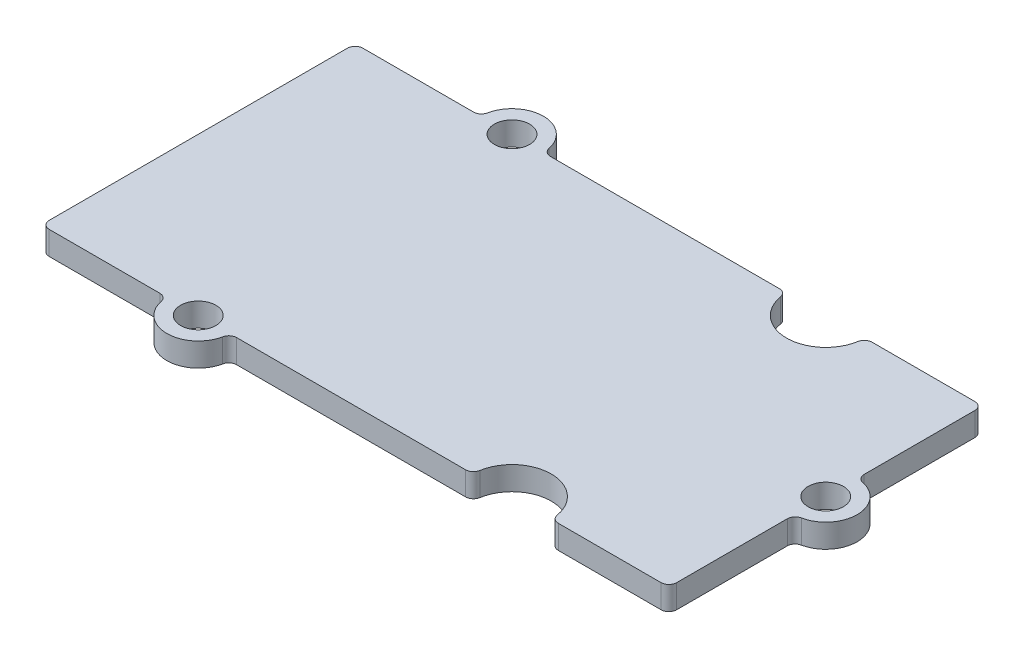
ISO-10303-21;
HEADER;
FILE_DESCRIPTION(('STEP AP214'),'2;1');
FILE_NAME('part.step','',(''),(''),'','','');
FILE_SCHEMA(('AUTOMOTIVE_DESIGN { 1 0 10303 214 1 1 1 1 }'));
ENDSEC;
DATA;
#1=APPLICATION_CONTEXT('core data for automotive mechanical design processes');
#2=APPLICATION_PROTOCOL_DEFINITION('international standard','automotive_design',2000,#1);
#3=PRODUCT_CONTEXT('',#1,'mechanical');
#4=PRODUCT('Part','Part','',(#3));
#5=PRODUCT_RELATED_PRODUCT_CATEGORY('part','',(#4));
#6=PRODUCT_DEFINITION_FORMATION('','',#4);
#7=PRODUCT_DEFINITION_CONTEXT('part definition',#1,'design');
#8=PRODUCT_DEFINITION('design','',#6,#7);
#9=PRODUCT_DEFINITION_SHAPE('','',#8);
#10=(LENGTH_UNIT() NAMED_UNIT(*) SI_UNIT(.MILLI.,.METRE.));
#11=(NAMED_UNIT(*) PLANE_ANGLE_UNIT() SI_UNIT($,.RADIAN.));
#12=(NAMED_UNIT(*) SI_UNIT($,.STERADIAN.) SOLID_ANGLE_UNIT());
#13=UNCERTAINTY_MEASURE_WITH_UNIT(LENGTH_MEASURE(1.E-05),#10,'distance_accuracy_value','');
#14=(GEOMETRIC_REPRESENTATION_CONTEXT(3) GLOBAL_UNCERTAINTY_ASSIGNED_CONTEXT((#13)) GLOBAL_UNIT_ASSIGNED_CONTEXT((#10,
#11,#12)) REPRESENTATION_CONTEXT('',''));
#15=CARTESIAN_POINT('',(0.,0.,0.));
#16=DIRECTION('',(0.,0.,1.));
#17=DIRECTION('',(1.,0.,0.));
#18=AXIS2_PLACEMENT_3D('',#15,#16,#17);
#19=CARTESIAN_POINT('',(10.,1.5,9.99999999999999));
#20=DIRECTION('',(0.,-1.,0.));
#21=DIRECTION('',(0.,0.,-1.));
#22=AXIS2_PLACEMENT_3D('',#19,#20,#21);
#23=CYLINDRICAL_SURFACE('',#22,2.5);
#24=CARTESIAN_POINT('',(10.,0.,9.99999999999999));
#25=DIRECTION('',(0.,1.,0.));
#26=DIRECTION('',(0.,0.,1.));
#27=AXIS2_PLACEMENT_3D('',#24,#25,#26);
#28=CIRCLE('',#27,2.5);
#29=CARTESIAN_POINT('',(7.53496675704184,0.,9.58333333333334));
#30=VERTEX_POINT('',#29);
#31=CARTESIAN_POINT('',(12.4650332429582,0.,9.58333333333334));
#32=VERTEX_POINT('',#31);
#33=EDGE_CURVE('E685',#30,#32,#28,.F.);
#34=ORIENTED_EDGE('',*,*,#33,.T.);
#35=DIRECTION('',(0.,-1.,0.));
#36=VECTOR('',#35,1.);
#37=CARTESIAN_POINT('',(12.4650332429582,1.5,9.58333333333334));
#38=LINE('',#37,#36);
#39=CARTESIAN_POINT('',(12.4650332429582,1.5,9.58333333333334));
#40=VERTEX_POINT('',#39);
#41=EDGE_CURVE('E473',#32,#40,#38,.F.);
#42=ORIENTED_EDGE('',*,*,#41,.T.);
#43=CARTESIAN_POINT('',(10.,1.5,9.99999999999999));
#44=DIRECTION('',(0.,1.,0.));
#45=DIRECTION('',(0.,0.,1.));
#46=AXIS2_PLACEMENT_3D('',#43,#44,#45);
#47=CIRCLE('',#46,2.5);
#48=CARTESIAN_POINT('',(7.53496675704184,1.5,9.58333333333334));
#49=VERTEX_POINT('',#48);
#50=EDGE_CURVE('E622',#49,#40,#47,.F.);
#51=ORIENTED_EDGE('',*,*,#50,.F.);
#52=DIRECTION('',(0.,-1.,0.));
#53=VECTOR('',#52,1.);
#54=CARTESIAN_POINT('',(7.53496675704184,1.5,9.58333333333334));
#55=LINE('',#54,#53);
#56=EDGE_CURVE('E469',#49,#30,#55,.T.);
#57=ORIENTED_EDGE('',*,*,#56,.T.);
#58=EDGE_LOOP('',(#34,#42,#51,#57));
#59=FACE_BOUND('',#58,.T.);
#60=ADVANCED_FACE('F178',(#59),#23,.F.);
#61=CARTESIAN_POINT('',(0.,1.5,10.));
#62=DIRECTION('',(0.,0.,-1.));
#63=DIRECTION('',(-1.,0.,0.));
#64=AXIS2_PLACEMENT_3D('',#61,#62,#63);
#65=PLANE('',#64);
#66=DIRECTION('',(1.,0.,0.));
#67=VECTOR('',#66,1.);
#68=CARTESIAN_POINT('',(0.,1.5,10.));
#69=LINE('',#68,#67);
#70=CARTESIAN_POINT('',(12.9580398915498,1.5,10.));
#71=VERTEX_POINT('',#70);
#72=CARTESIAN_POINT('',(19.5,1.5,10.));
#73=VERTEX_POINT('',#72);
#74=EDGE_CURVE('E402',#71,#73,#69,.T.);
#75=ORIENTED_EDGE('',*,*,#74,.F.);
#76=DIRECTION('',(0.,-1.,0.));
#77=VECTOR('',#76,1.);
#78=CARTESIAN_POINT('',(12.9580398915498,1.5,10.));
#79=LINE('',#78,#77);
#80=CARTESIAN_POINT('',(12.9580398915498,0.,10.));
#81=VERTEX_POINT('',#80);
#82=EDGE_CURVE('E465',#71,#81,#79,.T.);
#83=ORIENTED_EDGE('',*,*,#82,.T.);
#84=DIRECTION('',(1.,0.,0.));
#85=VECTOR('',#84,1.);
#86=CARTESIAN_POINT('',(0.,0.,10.));
#87=LINE('',#86,#85);
#88=CARTESIAN_POINT('',(19.5,0.,10.));
#89=VERTEX_POINT('',#88);
#90=EDGE_CURVE('E684',#81,#89,#87,.T.);
#91=ORIENTED_EDGE('',*,*,#90,.T.);
#92=DIRECTION('',(0.,-1.,0.));
#93=VECTOR('',#92,1.);
#94=CARTESIAN_POINT('',(19.5,1.5,10.));
#95=LINE('',#94,#93);
#96=EDGE_CURVE('E462',#89,#73,#95,.F.);
#97=ORIENTED_EDGE('',*,*,#96,.T.);
#98=EDGE_LOOP('',(#75,#83,#91,#97));
#99=FACE_BOUND('',#98,.T.);
#100=ADVANCED_FACE('F720',(#99),#65,.F.);
#101=CARTESIAN_POINT('',(20.,1.5,0.));
#102=DIRECTION('',(-1.,0.,0.));
#103=DIRECTION('',(0.,0.,1.));
#104=AXIS2_PLACEMENT_3D('',#101,#102,#103);
#105=PLANE('',#104);
#106=DIRECTION('',(0.,0.,-1.));
#107=VECTOR('',#106,1.);
#108=CARTESIAN_POINT('',(20.,0.,0.));
#109=LINE('',#108,#107);
#110=CARTESIAN_POINT('',(20.,0.,9.50000000000001));
#111=VERTEX_POINT('',#110);
#112=CARTESIAN_POINT('',(20.,0.,2.44948974278318));
#113=VERTEX_POINT('',#112);
#114=EDGE_CURVE('E680',#111,#113,#109,.T.);
#115=ORIENTED_EDGE('',*,*,#114,.T.);
#116=DIRECTION('',(0.,1.,0.));
#117=VECTOR('',#116,1.);
#118=CARTESIAN_POINT('',(20.,1.5,2.44948974278318));
#119=LINE('',#118,#117);
#120=CARTESIAN_POINT('',(20.,1.5,2.44948974278318));
#121=VERTEX_POINT('',#120);
#122=EDGE_CURVE('E494',#113,#121,#119,.T.);
#123=ORIENTED_EDGE('',*,*,#122,.T.);
#124=DIRECTION('',(0.,0.,-1.));
#125=VECTOR('',#124,1.);
#126=CARTESIAN_POINT('',(20.,1.5,0.));
#127=LINE('',#126,#125);
#128=CARTESIAN_POINT('',(20.,1.5,9.50000000000001));
#129=VERTEX_POINT('',#128);
#130=EDGE_CURVE('E616',#129,#121,#127,.T.);
#131=ORIENTED_EDGE('',*,*,#130,.F.);
#132=DIRECTION('',(0.,-1.,0.));
#133=VECTOR('',#132,1.);
#134=CARTESIAN_POINT('',(20.,1.5,9.50000000000001));
#135=LINE('',#134,#133);
#136=EDGE_CURVE('E490',#129,#111,#135,.T.);
#137=ORIENTED_EDGE('',*,*,#136,.T.);
#138=EDGE_LOOP('',(#115,#123,#131,#137));
#139=FACE_BOUND('',#138,.T.);
#140=ADVANCED_FACE('F748',(#139),#105,.F.);
#141=CARTESIAN_POINT('',(20.,1.5,-2.44948974278318));
#142=VERTEX_POINT('',#141);
#143=CARTESIAN_POINT('',(20.,1.5,-9.49999999999999));
#144=VERTEX_POINT('',#143);
#145=EDGE_CURVE('E610',#142,#144,#127,.T.);
#146=ORIENTED_EDGE('',*,*,#145,.F.);
#147=DIRECTION('',(0.,1.,0.));
#148=VECTOR('',#147,1.);
#149=CARTESIAN_POINT('',(20.,0.,-2.44948974278318));
#150=LINE('',#149,#148);
#151=CARTESIAN_POINT('',(20.,0.,-2.44948974278318));
#152=VERTEX_POINT('',#151);
#153=EDGE_CURVE('E500',#142,#152,#150,.F.);
#154=ORIENTED_EDGE('',*,*,#153,.T.);
#155=CARTESIAN_POINT('',(20.,0.,-9.49999999999999));
#156=VERTEX_POINT('',#155);
#157=EDGE_CURVE('E679',#152,#156,#109,.T.);
#158=ORIENTED_EDGE('',*,*,#157,.T.);
#159=DIRECTION('',(0.,-1.,0.));
#160=VECTOR('',#159,1.);
#161=CARTESIAN_POINT('',(20.,1.5,-9.49999999999999));
#162=LINE('',#161,#160);
#163=EDGE_CURVE('E497',#156,#144,#162,.F.);
#164=ORIENTED_EDGE('',*,*,#163,.T.);
#165=EDGE_LOOP('',(#146,#154,#158,#164));
#166=FACE_BOUND('',#165,.T.);
#167=ADVANCED_FACE('F730',(#166),#105,.F.);
#168=CARTESIAN_POINT('',(0.,1.5,-9.99999999999999));
#169=DIRECTION('',(0.,0.,-1.));
#170=DIRECTION('',(-1.,0.,0.));
#171=AXIS2_PLACEMENT_3D('',#168,#169,#170);
#172=PLANE('',#171);
#173=DIRECTION('',(1.,0.,0.));
#174=VECTOR('',#173,1.);
#175=CARTESIAN_POINT('',(0.,0.,-9.99999999999999));
#176=LINE('',#175,#174);
#177=CARTESIAN_POINT('',(12.9580398915498,0.,-9.99999999999999));
#178=VERTEX_POINT('',#177);
#179=CARTESIAN_POINT('',(19.5,0.,-9.99999999999999));
#180=VERTEX_POINT('',#179);
#181=EDGE_CURVE('E388',#178,#180,#176,.T.);
#182=ORIENTED_EDGE('',*,*,#181,.F.);
#183=DIRECTION('',(0.,-1.,0.));
#184=VECTOR('',#183,1.);
#185=CARTESIAN_POINT('',(12.9580398915498,1.5,-9.99999999999999));
#186=LINE('',#185,#184);
#187=CARTESIAN_POINT('',(12.9580398915498,1.5,-9.99999999999999));
#188=VERTEX_POINT('',#187);
#189=EDGE_CURVE('E430',#178,#188,#186,.F.);
#190=ORIENTED_EDGE('',*,*,#189,.T.);
#191=DIRECTION('',(1.,0.,0.));
#192=VECTOR('',#191,1.);
#193=CARTESIAN_POINT('',(0.,1.5,-9.99999999999999));
#194=LINE('',#193,#192);
#195=CARTESIAN_POINT('',(19.5,1.5,-9.99999999999999));
#196=VERTEX_POINT('',#195);
#197=EDGE_CURVE('E599',#188,#196,#194,.T.);
#198=ORIENTED_EDGE('',*,*,#197,.T.);
#199=DIRECTION('',(0.,-1.,0.));
#200=VECTOR('',#199,1.);
#201=CARTESIAN_POINT('',(19.5,0.,-9.99999999999999));
#202=LINE('',#201,#200);
#203=EDGE_CURVE('E426',#196,#180,#202,.T.);
#204=ORIENTED_EDGE('',*,*,#203,.T.);
#205=EDGE_LOOP('',(#182,#190,#198,#204));
#206=FACE_BOUND('',#205,.T.);
#207=ADVANCED_FACE('F739',(#206),#172,.T.);
#208=CARTESIAN_POINT('',(10.,1.5,-9.99999999999999));
#209=DIRECTION('',(0.,-1.,0.));
#210=DIRECTION('',(0.,0.,-1.));
#211=AXIS2_PLACEMENT_3D('',#208,#209,#210);
#212=CYLINDRICAL_SURFACE('',#211,2.5);
#213=CARTESIAN_POINT('',(10.,1.5,-9.99999999999999));
#214=DIRECTION('',(0.,1.,0.));
#215=DIRECTION('',(0.,0.,1.));
#216=AXIS2_PLACEMENT_3D('',#213,#214,#215);
#217=CIRCLE('',#216,2.5);
#218=CARTESIAN_POINT('',(7.53496675704184,1.5,-9.58333333333333));
#219=VERTEX_POINT('',#218);
#220=CARTESIAN_POINT('',(12.4650332429582,1.5,-9.58333333333333));
#221=VERTEX_POINT('',#220);
#222=EDGE_CURVE('E605',#219,#221,#217,.T.);
#223=ORIENTED_EDGE('',*,*,#222,.T.);
#224=DIRECTION('',(0.,-1.,0.));
#225=VECTOR('',#224,1.);
#226=CARTESIAN_POINT('',(12.4650332429582,1.5,-9.58333333333333));
#227=LINE('',#226,#225);
#228=CARTESIAN_POINT('',(12.4650332429582,0.,-9.58333333333333));
#229=VERTEX_POINT('',#228);
#230=EDGE_CURVE('E386',#221,#229,#227,.T.);
#231=ORIENTED_EDGE('',*,*,#230,.T.);
#232=CARTESIAN_POINT('',(10.,0.,-9.99999999999999));
#233=DIRECTION('',(0.,1.,0.));
#234=DIRECTION('',(0.,0.,1.));
#235=AXIS2_PLACEMENT_3D('',#232,#233,#234);
#236=CIRCLE('',#235,2.5);
#237=CARTESIAN_POINT('',(7.53496675704184,0.,-9.58333333333333));
#238=VERTEX_POINT('',#237);
#239=EDGE_CURVE('E368',#238,#229,#236,.T.);
#240=ORIENTED_EDGE('',*,*,#239,.F.);
#241=DIRECTION('',(0.,-1.,0.));
#242=VECTOR('',#241,1.);
#243=CARTESIAN_POINT('',(7.53496675704184,1.5,-9.58333333333333));
#244=LINE('',#243,#242);
#245=EDGE_CURVE('E383',#238,#219,#244,.F.);
#246=ORIENTED_EDGE('',*,*,#245,.T.);
#247=EDGE_LOOP('',(#223,#231,#240,#246));
#248=FACE_BOUND('',#247,.T.);
#249=ADVANCED_FACE('F382',(#248),#212,.F.);
#250=CARTESIAN_POINT('',(-7.55051025721681,1.5,-9.99999999999999));
#251=VERTEX_POINT('',#250);
#252=CARTESIAN_POINT('',(7.0419601084502,1.5,-9.99999999999999));
#253=VERTEX_POINT('',#252);
#254=EDGE_CURVE('E597',#251,#253,#194,.T.);
#255=ORIENTED_EDGE('',*,*,#254,.T.);
#256=DIRECTION('',(0.,-1.,0.));
#257=VECTOR('',#256,1.);
#258=CARTESIAN_POINT('',(7.0419601084502,1.5,-9.99999999999999));
#259=LINE('',#258,#257);
#260=CARTESIAN_POINT('',(7.0419601084502,0.,-9.99999999999999));
#261=VERTEX_POINT('',#260);
#262=EDGE_CURVE('E459',#253,#261,#259,.T.);
#263=ORIENTED_EDGE('',*,*,#262,.T.);
#264=CARTESIAN_POINT('',(-7.55051025721681,0.,-9.99999999999999));
#265=VERTEX_POINT('',#264);
#266=EDGE_CURVE('E370',#265,#261,#176,.T.);
#267=ORIENTED_EDGE('',*,*,#266,.F.);
#268=DIRECTION('',(0.,-1.,0.));
#269=VECTOR('',#268,1.);
#270=CARTESIAN_POINT('',(-7.55051025721681,1.5,-9.99999999999999));
#271=LINE('',#270,#269);
#272=EDGE_CURVE('E456',#265,#251,#271,.F.);
#273=ORIENTED_EDGE('',*,*,#272,.T.);
#274=EDGE_LOOP('',(#255,#263,#267,#273));
#275=FACE_BOUND('',#274,.T.);
#276=ADVANCED_FACE('F742',(#275),#172,.T.);
#277=CARTESIAN_POINT('',(-19.5,1.5,-9.99999999999999));
#278=VERTEX_POINT('',#277);
#279=CARTESIAN_POINT('',(-12.4494897427832,1.5,-9.99999999999999));
#280=VERTEX_POINT('',#279);
#281=EDGE_CURVE('E591',#278,#280,#194,.T.);
#282=ORIENTED_EDGE('',*,*,#281,.T.);
#283=DIRECTION('',(0.,-1.,0.));
#284=VECTOR('',#283,1.);
#285=CARTESIAN_POINT('',(-12.4494897427832,1.5,-9.99999999999999));
#286=LINE('',#285,#284);
#287=CARTESIAN_POINT('',(-12.4494897427832,0.,-9.99999999999999));
#288=VERTEX_POINT('',#287);
#289=EDGE_CURVE('E527',#280,#288,#286,.T.);
#290=ORIENTED_EDGE('',*,*,#289,.T.);
#291=CARTESIAN_POINT('',(-19.5,0.,-9.99999999999999));
#292=VERTEX_POINT('',#291);
#293=EDGE_CURVE('E572',#292,#288,#176,.T.);
#294=ORIENTED_EDGE('',*,*,#293,.F.);
#295=DIRECTION('',(0.,-1.,0.));
#296=VECTOR('',#295,1.);
#297=CARTESIAN_POINT('',(-19.5,1.5,-9.99999999999999));
#298=LINE('',#297,#296);
#299=EDGE_CURVE('E524',#292,#278,#298,.F.);
#300=ORIENTED_EDGE('',*,*,#299,.T.);
#301=EDGE_LOOP('',(#282,#290,#294,#300));
#302=FACE_BOUND('',#301,.T.);
#303=ADVANCED_FACE('F594',(#302),#172,.T.);
#304=CARTESIAN_POINT('',(-20.,1.5,0.));
#305=DIRECTION('',(-1.,0.,0.));
#306=DIRECTION('',(0.,0.,1.));
#307=AXIS2_PLACEMENT_3D('',#304,#305,#306);
#308=PLANE('',#307);
#309=DIRECTION('',(0.,0.,-1.));
#310=VECTOR('',#309,1.);
#311=CARTESIAN_POINT('',(-20.,1.5,0.));
#312=LINE('',#311,#310);
#313=CARTESIAN_POINT('',(-20.,1.5,9.50000000000001));
#314=VERTEX_POINT('',#313);
#315=CARTESIAN_POINT('',(-20.,1.5,-9.49999999999999));
#316=VERTEX_POINT('',#315);
#317=EDGE_CURVE('E400',#314,#316,#312,.T.);
#318=ORIENTED_EDGE('',*,*,#317,.T.);
#319=DIRECTION('',(0.,-1.,0.));
#320=VECTOR('',#319,1.);
#321=CARTESIAN_POINT('',(-20.,1.5,-9.49999999999999));
#322=LINE('',#321,#320);
#323=CARTESIAN_POINT('',(-20.,0.,-9.49999999999999));
#324=VERTEX_POINT('',#323);
#325=EDGE_CURVE('E534',#316,#324,#322,.T.);
#326=ORIENTED_EDGE('',*,*,#325,.T.);
#327=DIRECTION('',(0.,0.,-1.));
#328=VECTOR('',#327,1.);
#329=CARTESIAN_POINT('',(-20.,0.,0.));
#330=LINE('',#329,#328);
#331=CARTESIAN_POINT('',(-20.,0.,9.50000000000001));
#332=VERTEX_POINT('',#331);
#333=EDGE_CURVE('E671',#332,#324,#330,.T.);
#334=ORIENTED_EDGE('',*,*,#333,.F.);
#335=DIRECTION('',(0.,-1.,0.));
#336=VECTOR('',#335,1.);
#337=CARTESIAN_POINT('',(-20.,1.5,9.50000000000001));
#338=LINE('',#337,#336);
#339=EDGE_CURVE('E531',#332,#314,#338,.F.);
#340=ORIENTED_EDGE('',*,*,#339,.T.);
#341=EDGE_LOOP('',(#318,#326,#334,#340));
#342=FACE_BOUND('',#341,.T.);
#343=ADVANCED_FACE('F754',(#342),#308,.T.);
#344=CARTESIAN_POINT('',(-19.5,0.,10.));
#345=VERTEX_POINT('',#344);
#346=CARTESIAN_POINT('',(-12.4494897427832,0.,10.));
#347=VERTEX_POINT('',#346);
#348=EDGE_CURVE('E674',#345,#347,#87,.T.);
#349=ORIENTED_EDGE('',*,*,#348,.T.);
#350=DIRECTION('',(0.,-1.,0.));
#351=VECTOR('',#350,1.);
#352=CARTESIAN_POINT('',(-12.4494897427832,1.5,10.));
#353=LINE('',#352,#351);
#354=CARTESIAN_POINT('',(-12.4494897427832,1.5,10.));
#355=VERTEX_POINT('',#354);
#356=EDGE_CURVE('E514',#347,#355,#353,.F.);
#357=ORIENTED_EDGE('',*,*,#356,.T.);
#358=CARTESIAN_POINT('',(-19.5,1.5,10.));
#359=VERTEX_POINT('',#358);
#360=EDGE_CURVE('E394',#359,#355,#69,.T.);
#361=ORIENTED_EDGE('',*,*,#360,.F.);
#362=DIRECTION('',(0.,-1.,0.));
#363=VECTOR('',#362,1.);
#364=CARTESIAN_POINT('',(-19.5,0.,10.));
#365=LINE('',#364,#363);
#366=EDGE_CURVE('E510',#359,#345,#365,.T.);
#367=ORIENTED_EDGE('',*,*,#366,.T.);
#368=EDGE_LOOP('',(#349,#357,#361,#367));
#369=FACE_BOUND('',#368,.T.);
#370=ADVANCED_FACE('F761',(#369),#65,.F.);
#371=CARTESIAN_POINT('',(-7.55051025721681,0.,10.));
#372=VERTEX_POINT('',#371);
#373=CARTESIAN_POINT('',(7.0419601084502,0.,10.));
#374=VERTEX_POINT('',#373);
#375=EDGE_CURVE('E670',#372,#374,#87,.T.);
#376=ORIENTED_EDGE('',*,*,#375,.T.);
#377=DIRECTION('',(0.,-1.,0.));
#378=VECTOR('',#377,1.);
#379=CARTESIAN_POINT('',(7.0419601084502,1.5,10.));
#380=LINE('',#379,#378);
#381=CARTESIAN_POINT('',(7.0419601084502,1.5,10.));
#382=VERTEX_POINT('',#381);
#383=EDGE_CURVE('E480',#374,#382,#380,.F.);
#384=ORIENTED_EDGE('',*,*,#383,.T.);
#385=CARTESIAN_POINT('',(-7.55051025721681,1.5,10.));
#386=VERTEX_POINT('',#385);
#387=EDGE_CURVE('E403',#386,#382,#69,.T.);
#388=ORIENTED_EDGE('',*,*,#387,.F.);
#389=DIRECTION('',(0.,-1.,0.));
#390=VECTOR('',#389,1.);
#391=CARTESIAN_POINT('',(-7.55051025721681,1.5,10.));
#392=LINE('',#391,#390);
#393=EDGE_CURVE('E476',#386,#372,#392,.T.);
#394=ORIENTED_EDGE('',*,*,#393,.T.);
#395=EDGE_LOOP('',(#376,#384,#388,#394));
#396=FACE_BOUND('',#395,.T.);
#397=ADVANCED_FACE('F701',(#396),#65,.F.);
#398=CARTESIAN_POINT('',(0.,0.,0.));
#399=DIRECTION('',(0.,1.,0.));
#400=DIRECTION('',(0.,0.,1.));
#401=AXIS2_PLACEMENT_3D('',#398,#399,#400);
#402=PLANE('',#401);
#403=CARTESIAN_POINT('',(20.,0.,0.));
#404=DIRECTION('',(0.,1.,0.));
#405=DIRECTION('',(0.,0.,1.));
#406=AXIS2_PLACEMENT_3D('',#403,#404,#405);
#407=CIRCLE('',#406,1.125);
#408=CARTESIAN_POINT('',(20.,0.,1.125));
#409=VERTEX_POINT('',#408);
#410=EDGE_CURVE('E646',#409,#409,#407,.T.);
#411=ORIENTED_EDGE('',*,*,#410,.T.);
#412=EDGE_LOOP('',(#411));
#413=FACE_BOUND('',#412,.T.);
#414=CARTESIAN_POINT('',(-9.99999999999999,0.,9.99999999999999));
#415=DIRECTION('',(0.,1.,0.));
#416=DIRECTION('',(0.,0.,1.));
#417=AXIS2_PLACEMENT_3D('',#414,#415,#416);
#418=CIRCLE('',#417,1.125);
#419=CARTESIAN_POINT('',(-9.99999999999999,0.,11.125));
#420=VERTEX_POINT('',#419);
#421=EDGE_CURVE('E638',#420,#420,#418,.T.);
#422=ORIENTED_EDGE('',*,*,#421,.T.);
#423=EDGE_LOOP('',(#422));
#424=FACE_BOUND('',#423,.T.);
#425=CARTESIAN_POINT('',(-9.99999999999999,0.,-9.99999999999999));
#426=DIRECTION('',(0.,1.,0.));
#427=DIRECTION('',(0.,0.,1.));
#428=AXIS2_PLACEMENT_3D('',#425,#426,#427);
#429=CIRCLE('',#428,1.125);
#430=CARTESIAN_POINT('',(-9.99999999999999,0.,-8.875));
#431=VERTEX_POINT('',#430);
#432=EDGE_CURVE('E630',#431,#431,#429,.T.);
#433=ORIENTED_EDGE('',*,*,#432,.T.);
#434=EDGE_LOOP('',(#433));
#435=FACE_BOUND('',#434,.T.);
#436=ORIENTED_EDGE('',*,*,#239,.T.);
#437=CARTESIAN_POINT('',(12.9580398915498,0.,-9.49999999999999));
#438=DIRECTION('',(0.,1.,0.));
#439=DIRECTION('',(0.,0.,1.));
#440=AXIS2_PLACEMENT_3D('',#437,#438,#439);
#441=CIRCLE('',#440,0.5);
#442=EDGE_CURVE('E376',#229,#178,#441,.F.);
#443=ORIENTED_EDGE('',*,*,#442,.T.);
#444=ORIENTED_EDGE('',*,*,#181,.T.);
#445=CARTESIAN_POINT('',(19.5,0.,-9.49999999999999));
#446=DIRECTION('',(0.,1.,0.));
#447=DIRECTION('',(0.,0.,1.));
#448=AXIS2_PLACEMENT_3D('',#445,#446,#447);
#449=CIRCLE('',#448,0.5);
#450=EDGE_CURVE('E416',#180,#156,#449,.F.);
#451=ORIENTED_EDGE('',*,*,#450,.T.);
#452=ORIENTED_EDGE('',*,*,#157,.F.);
#453=CARTESIAN_POINT('',(20.5,0.,-2.44948974278318));
#454=DIRECTION('',(0.,1.,0.));
#455=DIRECTION('',(0.,0.,1.));
#456=AXIS2_PLACEMENT_3D('',#453,#454,#455);
#457=CIRCLE('',#456,0.5);
#458=CARTESIAN_POINT('',(20.4,0.,-1.95959179422654));
#459=VERTEX_POINT('',#458);
#460=EDGE_CURVE('E544',#152,#459,#457,.T.);
#461=ORIENTED_EDGE('',*,*,#460,.T.);
#462=CARTESIAN_POINT('',(20.,0.,0.));
#463=DIRECTION('',(0.,1.,0.));
#464=DIRECTION('',(0.,0.,1.));
#465=AXIS2_PLACEMENT_3D('',#462,#463,#464);
#466=CIRCLE('',#465,2.);
#467=CARTESIAN_POINT('',(20.4,0.,1.95959179422654));
#468=VERTEX_POINT('',#467);
#469=EDGE_CURVE('E405',#468,#459,#466,.T.);
#470=ORIENTED_EDGE('',*,*,#469,.F.);
#471=CARTESIAN_POINT('',(20.5,0.,2.44948974278318));
#472=DIRECTION('',(0.,1.,0.));
#473=DIRECTION('',(0.,0.,1.));
#474=AXIS2_PLACEMENT_3D('',#471,#472,#473);
#475=CIRCLE('',#474,0.5);
#476=EDGE_CURVE('E538',#468,#113,#475,.T.);
#477=ORIENTED_EDGE('',*,*,#476,.T.);
#478=ORIENTED_EDGE('',*,*,#114,.F.);
#479=CARTESIAN_POINT('',(19.5,0.,9.50000000000001));
#480=DIRECTION('',(0.,1.,0.));
#481=DIRECTION('',(0.,0.,1.));
#482=AXIS2_PLACEMENT_3D('',#479,#480,#481);
#483=CIRCLE('',#482,0.5);
#484=EDGE_CURVE('E413',#111,#89,#483,.F.);
#485=ORIENTED_EDGE('',*,*,#484,.T.);
#486=ORIENTED_EDGE('',*,*,#90,.F.);
#487=CARTESIAN_POINT('',(12.9580398915498,0.,9.50000000000001));
#488=DIRECTION('',(0.,1.,0.));
#489=DIRECTION('',(0.,0.,1.));
#490=AXIS2_PLACEMENT_3D('',#487,#488,#489);
#491=CIRCLE('',#490,0.5);
#492=EDGE_CURVE('E377',#81,#32,#491,.F.);
#493=ORIENTED_EDGE('',*,*,#492,.T.);
#494=ORIENTED_EDGE('',*,*,#33,.F.);
#495=CARTESIAN_POINT('',(7.0419601084502,0.,9.50000000000001));
#496=DIRECTION('',(0.,1.,0.));
#497=DIRECTION('',(0.,0.,1.));
#498=AXIS2_PLACEMENT_3D('',#495,#496,#497);
#499=CIRCLE('',#498,0.5);
#500=EDGE_CURVE('E419',#30,#374,#499,.F.);
#501=ORIENTED_EDGE('',*,*,#500,.T.);
#502=ORIENTED_EDGE('',*,*,#375,.F.);
#503=CARTESIAN_POINT('',(-7.55051025721681,0.,10.5));
#504=DIRECTION('',(0.,1.,0.));
#505=DIRECTION('',(0.,0.,1.));
#506=AXIS2_PLACEMENT_3D('',#503,#504,#505);
#507=CIRCLE('',#506,0.5);
#508=CARTESIAN_POINT('',(-8.04040820577345,0.,10.4));
#509=VERTEX_POINT('',#508);
#510=EDGE_CURVE('E550',#372,#509,#507,.T.);
#511=ORIENTED_EDGE('',*,*,#510,.T.);
#512=CARTESIAN_POINT('',(-9.99999999999999,0.,9.99999999999999));
#513=DIRECTION('',(0.,-1.,0.));
#514=DIRECTION('',(0.,0.,-1.));
#515=AXIS2_PLACEMENT_3D('',#512,#513,#514);
#516=CIRCLE('',#515,2.);
#517=CARTESIAN_POINT('',(-11.9595917942265,0.,10.4));
#518=VERTEX_POINT('',#517);
#519=EDGE_CURVE('E663',#509,#518,#516,.T.);
#520=ORIENTED_EDGE('',*,*,#519,.T.);
#521=CARTESIAN_POINT('',(-12.4494897427832,0.,10.5));
#522=DIRECTION('',(0.,1.,0.));
#523=DIRECTION('',(0.,0.,1.));
#524=AXIS2_PLACEMENT_3D('',#521,#522,#523);
#525=CIRCLE('',#524,0.5);
#526=EDGE_CURVE('E556',#518,#347,#525,.T.);
#527=ORIENTED_EDGE('',*,*,#526,.T.);
#528=ORIENTED_EDGE('',*,*,#348,.F.);
#529=CARTESIAN_POINT('',(-19.5,0.,9.50000000000001));
#530=DIRECTION('',(0.,1.,0.));
#531=DIRECTION('',(0.,0.,1.));
#532=AXIS2_PLACEMENT_3D('',#529,#530,#531);
#533=CIRCLE('',#532,0.5);
#534=EDGE_CURVE('E398',#345,#332,#533,.F.);
#535=ORIENTED_EDGE('',*,*,#534,.T.);
#536=ORIENTED_EDGE('',*,*,#333,.T.);
#537=CARTESIAN_POINT('',(-19.5,0.,-9.49999999999999));
#538=DIRECTION('',(0.,1.,0.));
#539=DIRECTION('',(0.,0.,1.));
#540=AXIS2_PLACEMENT_3D('',#537,#538,#539);
#541=CIRCLE('',#540,0.5);
#542=EDGE_CURVE('E410',#324,#292,#541,.F.);
#543=ORIENTED_EDGE('',*,*,#542,.T.);
#544=ORIENTED_EDGE('',*,*,#293,.T.);
#545=CARTESIAN_POINT('',(-12.4494897427832,0.,-10.5));
#546=DIRECTION('',(0.,1.,0.));
#547=DIRECTION('',(0.,0.,1.));
#548=AXIS2_PLACEMENT_3D('',#545,#546,#547);
#549=CIRCLE('',#548,0.5);
#550=CARTESIAN_POINT('',(-11.9595917942265,0.,-10.4));
#551=VERTEX_POINT('',#550);
#552=EDGE_CURVE('E187',#288,#551,#549,.T.);
#553=ORIENTED_EDGE('',*,*,#552,.T.);
#554=CARTESIAN_POINT('',(-9.99999999999999,0.,-9.99999999999999));
#555=DIRECTION('',(0.,1.,0.));
#556=DIRECTION('',(0.,0.,1.));
#557=AXIS2_PLACEMENT_3D('',#554,#555,#556);
#558=CIRCLE('',#557,2.);
#559=CARTESIAN_POINT('',(-8.04040820577345,0.,-10.4));
#560=VERTEX_POINT('',#559);
#561=EDGE_CURVE('E570',#560,#551,#558,.T.);
#562=ORIENTED_EDGE('',*,*,#561,.F.);
#563=CARTESIAN_POINT('',(-7.55051025721681,0.,-10.5));
#564=DIRECTION('',(0.,1.,0.));
#565=DIRECTION('',(0.,0.,1.));
#566=AXIS2_PLACEMENT_3D('',#563,#564,#565);
#567=CIRCLE('',#566,0.5);
#568=EDGE_CURVE('E561',#560,#265,#567,.T.);
#569=ORIENTED_EDGE('',*,*,#568,.T.);
#570=ORIENTED_EDGE('',*,*,#266,.T.);
#571=CARTESIAN_POINT('',(7.0419601084502,0.,-9.49999999999999));
#572=DIRECTION('',(0.,1.,0.));
#573=DIRECTION('',(0.,0.,1.));
#574=AXIS2_PLACEMENT_3D('',#571,#572,#573);
#575=CIRCLE('',#574,0.5);
#576=EDGE_CURVE('E365',#261,#238,#575,.F.);
#577=ORIENTED_EDGE('',*,*,#576,.T.);
#578=EDGE_LOOP('',(#436,#443,#444,#451,#452,#461,#470,#477,#478,#485,#486,#493,#494,#501,#502,
#511,#520,#527,#528,#535,#536,#543,#544,#553,#562,#569,#570,#577));
#579=FACE_BOUND('',#578,.T.);
#580=ADVANCED_FACE('F367',(#413,#424,#435,#579),#402,.F.);
#581=CARTESIAN_POINT('',(0.,1.5,0.));
#582=DIRECTION('',(0.,1.,0.));
#583=DIRECTION('',(0.,0.,1.));
#584=AXIS2_PLACEMENT_3D('',#581,#582,#583);
#585=PLANE('',#584);
#586=CARTESIAN_POINT('',(20.,1.5,0.));
#587=DIRECTION('',(0.,1.,0.));
#588=DIRECTION('',(0.,0.,1.));
#589=AXIS2_PLACEMENT_3D('',#586,#587,#588);
#590=CIRCLE('',#589,1.125);
#591=CARTESIAN_POINT('',(20.,1.5,1.125));
#592=VERTEX_POINT('',#591);
#593=EDGE_CURVE('E642',#592,#592,#590,.T.);
#594=ORIENTED_EDGE('',*,*,#593,.F.);
#595=EDGE_LOOP('',(#594));
#596=FACE_BOUND('',#595,.T.);
#597=CARTESIAN_POINT('',(-9.99999999999999,1.5,9.99999999999999));
#598=DIRECTION('',(0.,1.,0.));
#599=DIRECTION('',(0.,0.,1.));
#600=AXIS2_PLACEMENT_3D('',#597,#598,#599);
#601=CIRCLE('',#600,1.125);
#602=CARTESIAN_POINT('',(-9.99999999999999,1.5,11.125));
#603=VERTEX_POINT('',#602);
#604=EDGE_CURVE('E634',#603,#603,#601,.T.);
#605=ORIENTED_EDGE('',*,*,#604,.F.);
#606=EDGE_LOOP('',(#605));
#607=FACE_BOUND('',#606,.T.);
#608=CARTESIAN_POINT('',(-9.99999999999999,1.5,-9.99999999999999));
#609=DIRECTION('',(0.,1.,0.));
#610=DIRECTION('',(0.,0.,1.));
#611=AXIS2_PLACEMENT_3D('',#608,#609,#610);
#612=CIRCLE('',#611,1.125);
#613=CARTESIAN_POINT('',(-9.99999999999999,1.5,-8.875));
#614=VERTEX_POINT('',#613);
#615=EDGE_CURVE('E626',#614,#614,#612,.T.);
#616=ORIENTED_EDGE('',*,*,#615,.F.);
#617=EDGE_LOOP('',(#616));
#618=FACE_BOUND('',#617,.T.);
#619=ORIENTED_EDGE('',*,*,#197,.F.);
#620=CARTESIAN_POINT('',(12.9580398915498,1.5,-9.49999999999999));
#621=DIRECTION('',(0.,1.,0.));
#622=DIRECTION('',(0.,0.,1.));
#623=AXIS2_PLACEMENT_3D('',#620,#621,#622);
#624=CIRCLE('',#623,0.5);
#625=EDGE_CURVE('E453',#188,#221,#624,.T.);
#626=ORIENTED_EDGE('',*,*,#625,.T.);
#627=ORIENTED_EDGE('',*,*,#222,.F.);
#628=CARTESIAN_POINT('',(7.0419601084502,1.5,-9.49999999999999));
#629=DIRECTION('',(0.,1.,0.));
#630=DIRECTION('',(0.,0.,1.));
#631=AXIS2_PLACEMENT_3D('',#628,#629,#630);
#632=CIRCLE('',#631,0.5);
#633=EDGE_CURVE('E392',#219,#253,#632,.T.);
#634=ORIENTED_EDGE('',*,*,#633,.T.);
#635=ORIENTED_EDGE('',*,*,#254,.F.);
#636=CARTESIAN_POINT('',(-7.55051025721681,1.5,-10.5));
#637=DIRECTION('',(0.,1.,0.));
#638=DIRECTION('',(0.,0.,1.));
#639=AXIS2_PLACEMENT_3D('',#636,#637,#638);
#640=CIRCLE('',#639,0.5);
#641=CARTESIAN_POINT('',(-8.04040820577345,1.5,-10.4));
#642=VERTEX_POINT('',#641);
#643=EDGE_CURVE('E564',#251,#642,#640,.F.);
#644=ORIENTED_EDGE('',*,*,#643,.T.);
#645=CARTESIAN_POINT('',(-9.99999999999999,1.5,-9.99999999999999));
#646=DIRECTION('',(0.,1.,0.));
#647=DIRECTION('',(0.,0.,1.));
#648=AXIS2_PLACEMENT_3D('',#645,#646,#647);
#649=CIRCLE('',#648,2.);
#650=CARTESIAN_POINT('',(-11.9595917942265,1.5,-10.4));
#651=VERTEX_POINT('',#650);
#652=EDGE_CURVE('E582',#642,#651,#649,.T.);
#653=ORIENTED_EDGE('',*,*,#652,.T.);
#654=CARTESIAN_POINT('',(-12.4494897427832,1.5,-10.5));
#655=DIRECTION('',(0.,1.,0.));
#656=DIRECTION('',(0.,0.,1.));
#657=AXIS2_PLACEMENT_3D('',#654,#655,#656);
#658=CIRCLE('',#657,0.5);
#659=EDGE_CURVE('E12',#651,#280,#658,.F.);
#660=ORIENTED_EDGE('',*,*,#659,.T.);
#661=ORIENTED_EDGE('',*,*,#281,.F.);
#662=CARTESIAN_POINT('',(-19.5,1.5,-9.49999999999999));
#663=DIRECTION('',(0.,1.,0.));
#664=DIRECTION('',(0.,0.,1.));
#665=AXIS2_PLACEMENT_3D('',#662,#663,#664);
#666=CIRCLE('',#665,0.5);
#667=EDGE_CURVE('E436',#278,#316,#666,.T.);
#668=ORIENTED_EDGE('',*,*,#667,.T.);
#669=ORIENTED_EDGE('',*,*,#317,.F.);
#670=CARTESIAN_POINT('',(-19.5,1.5,9.50000000000001));
#671=DIRECTION('',(0.,1.,0.));
#672=DIRECTION('',(0.,0.,1.));
#673=AXIS2_PLACEMENT_3D('',#670,#671,#672);
#674=CIRCLE('',#673,0.5);
#675=EDGE_CURVE('E433',#314,#359,#674,.T.);
#676=ORIENTED_EDGE('',*,*,#675,.T.);
#677=ORIENTED_EDGE('',*,*,#360,.T.);
#678=CARTESIAN_POINT('',(-12.4494897427832,1.5,10.5));
#679=DIRECTION('',(0.,1.,0.));
#680=DIRECTION('',(0.,0.,1.));
#681=AXIS2_PLACEMENT_3D('',#678,#679,#680);
#682=CIRCLE('',#681,0.5);
#683=CARTESIAN_POINT('',(-11.9595917942265,1.5,10.4));
#684=VERTEX_POINT('',#683);
#685=EDGE_CURVE('E194',#355,#684,#682,.F.);
#686=ORIENTED_EDGE('',*,*,#685,.T.);
#687=CARTESIAN_POINT('',(-9.99999999999999,1.5,9.99999999999999));
#688=DIRECTION('',(0.,-1.,0.));
#689=DIRECTION('',(0.,0.,-1.));
#690=AXIS2_PLACEMENT_3D('',#687,#688,#689);
#691=CIRCLE('',#690,2.);
#692=CARTESIAN_POINT('',(-8.04040820577345,1.5,10.4));
#693=VERTEX_POINT('',#692);
#694=EDGE_CURVE('E667',#693,#684,#691,.T.);
#695=ORIENTED_EDGE('',*,*,#694,.F.);
#696=CARTESIAN_POINT('',(-7.55051025721681,1.5,10.5));
#697=DIRECTION('',(0.,1.,0.));
#698=DIRECTION('',(0.,0.,1.));
#699=AXIS2_PLACEMENT_3D('',#696,#697,#698);
#700=CIRCLE('',#699,0.5);
#701=EDGE_CURVE('E553',#693,#386,#700,.F.);
#702=ORIENTED_EDGE('',*,*,#701,.T.);
#703=ORIENTED_EDGE('',*,*,#387,.T.);
#704=CARTESIAN_POINT('',(7.0419601084502,1.5,9.50000000000001));
#705=DIRECTION('',(0.,1.,0.));
#706=DIRECTION('',(0.,0.,1.));
#707=AXIS2_PLACEMENT_3D('',#704,#705,#706);
#708=CIRCLE('',#707,0.5);
#709=EDGE_CURVE('E445',#382,#49,#708,.T.);
#710=ORIENTED_EDGE('',*,*,#709,.T.);
#711=ORIENTED_EDGE('',*,*,#50,.T.);
#712=CARTESIAN_POINT('',(12.9580398915498,1.5,9.50000000000001));
#713=DIRECTION('',(0.,1.,0.));
#714=DIRECTION('',(0.,0.,1.));
#715=AXIS2_PLACEMENT_3D('',#712,#713,#714);
#716=CIRCLE('',#715,0.5);
#717=EDGE_CURVE('E448',#40,#71,#716,.T.);
#718=ORIENTED_EDGE('',*,*,#717,.T.);
#719=ORIENTED_EDGE('',*,*,#74,.T.);
#720=CARTESIAN_POINT('',(19.5,1.5,9.50000000000001));
#721=DIRECTION('',(0.,1.,0.));
#722=DIRECTION('',(0.,0.,1.));
#723=AXIS2_PLACEMENT_3D('',#720,#721,#722);
#724=CIRCLE('',#723,0.5);
#725=EDGE_CURVE('E439',#73,#129,#724,.T.);
#726=ORIENTED_EDGE('',*,*,#725,.T.);
#727=ORIENTED_EDGE('',*,*,#130,.T.);
#728=CARTESIAN_POINT('',(20.5,1.5,2.44948974278318));
#729=DIRECTION('',(0.,1.,0.));
#730=DIRECTION('',(0.,0.,1.));
#731=AXIS2_PLACEMENT_3D('',#728,#729,#730);
#732=CIRCLE('',#731,0.5);
#733=CARTESIAN_POINT('',(20.4,1.5,1.95959179422654));
#734=VERTEX_POINT('',#733);
#735=EDGE_CURVE('E541',#121,#734,#732,.F.);
#736=ORIENTED_EDGE('',*,*,#735,.T.);
#737=CARTESIAN_POINT('',(20.,1.5,0.));
#738=DIRECTION('',(0.,1.,0.));
#739=DIRECTION('',(0.,0.,1.));
#740=AXIS2_PLACEMENT_3D('',#737,#738,#739);
#741=CIRCLE('',#740,2.);
#742=CARTESIAN_POINT('',(20.4,1.5,-1.95959179422654));
#743=VERTEX_POINT('',#742);
#744=EDGE_CURVE('E583',#734,#743,#741,.T.);
#745=ORIENTED_EDGE('',*,*,#744,.T.);
#746=CARTESIAN_POINT('',(20.5,1.5,-2.44948974278318));
#747=DIRECTION('',(0.,1.,0.));
#748=DIRECTION('',(0.,0.,1.));
#749=AXIS2_PLACEMENT_3D('',#746,#747,#748);
#750=CIRCLE('',#749,0.5);
#751=EDGE_CURVE('E547',#743,#142,#750,.F.);
#752=ORIENTED_EDGE('',*,*,#751,.T.);
#753=ORIENTED_EDGE('',*,*,#145,.T.);
#754=CARTESIAN_POINT('',(19.5,1.5,-9.49999999999999));
#755=DIRECTION('',(0.,1.,0.));
#756=DIRECTION('',(0.,0.,1.));
#757=AXIS2_PLACEMENT_3D('',#754,#755,#756);
#758=CIRCLE('',#757,0.5);
#759=EDGE_CURVE('E442',#144,#196,#758,.T.);
#760=ORIENTED_EDGE('',*,*,#759,.T.);
#761=EDGE_LOOP('',(#619,#626,#627,#634,#635,#644,#653,#660,#661,#668,#669,#676,#677,#686,#695,
#702,#703,#710,#711,#718,#719,#726,#727,#736,#745,#752,#753,#760));
#762=FACE_BOUND('',#761,.T.);
#763=ADVANCED_FACE('F590',(#596,#607,#618,#762),#585,.T.);
#764=CARTESIAN_POINT('',(20.,1.5,0.));
#765=DIRECTION('',(0.,-1.,0.));
#766=DIRECTION('',(0.,0.,-1.));
#767=AXIS2_PLACEMENT_3D('',#764,#765,#766);
#768=CYLINDRICAL_SURFACE('',#767,2.);
#769=ORIENTED_EDGE('',*,*,#744,.F.);
#770=DIRECTION('',(0.,-1.,0.));
#771=VECTOR('',#770,1.);
#772=CARTESIAN_POINT('',(20.4,1.5,1.95959179422654));
#773=LINE('',#772,#771);
#774=EDGE_CURVE('E486',#734,#468,#773,.T.);
#775=ORIENTED_EDGE('',*,*,#774,.T.);
#776=ORIENTED_EDGE('',*,*,#469,.T.);
#777=DIRECTION('',(0.,-1.,0.));
#778=VECTOR('',#777,1.);
#779=CARTESIAN_POINT('',(20.4,1.5,-1.95959179422654));
#780=LINE('',#779,#778);
#781=EDGE_CURVE('E483',#459,#743,#780,.F.);
#782=ORIENTED_EDGE('',*,*,#781,.T.);
#783=EDGE_LOOP('',(#769,#775,#776,#782));
#784=FACE_BOUND('',#783,.T.);
#785=ADVANCED_FACE('F768',(#784),#768,.T.);
#786=CARTESIAN_POINT('',(-9.99999999999999,1.5,-9.99999999999999));
#787=DIRECTION('',(0.,-1.,0.));
#788=DIRECTION('',(0.,0.,-1.));
#789=AXIS2_PLACEMENT_3D('',#786,#787,#788);
#790=CYLINDRICAL_SURFACE('',#789,2.);
#791=ORIENTED_EDGE('',*,*,#652,.F.);
#792=DIRECTION('',(0.,-1.,0.));
#793=VECTOR('',#792,1.);
#794=CARTESIAN_POINT('',(-8.04040820577345,1.5,-10.4));
#795=LINE('',#794,#793);
#796=EDGE_CURVE('E520',#642,#560,#795,.T.);
#797=ORIENTED_EDGE('',*,*,#796,.T.);
#798=ORIENTED_EDGE('',*,*,#561,.T.);
#799=DIRECTION('',(0.,-1.,0.));
#800=VECTOR('',#799,1.);
#801=CARTESIAN_POINT('',(-11.9595917942265,1.5,-10.4));
#802=LINE('',#801,#800);
#803=EDGE_CURVE('E517',#551,#651,#802,.F.);
#804=ORIENTED_EDGE('',*,*,#803,.T.);
#805=EDGE_LOOP('',(#791,#797,#798,#804));
#806=FACE_BOUND('',#805,.T.);
#807=ADVANCED_FACE('F578',(#806),#790,.T.);
#808=CARTESIAN_POINT('',(-9.99999999999999,1.5,9.99999999999999));
#809=DIRECTION('',(0.,-1.,0.));
#810=DIRECTION('',(0.,0.,-1.));
#811=AXIS2_PLACEMENT_3D('',#808,#809,#810);
#812=CYLINDRICAL_SURFACE('',#811,2.);
#813=ORIENTED_EDGE('',*,*,#519,.F.);
#814=DIRECTION('',(0.,-1.,0.));
#815=VECTOR('',#814,1.);
#816=CARTESIAN_POINT('',(-8.04040820577345,1.5,10.4));
#817=LINE('',#816,#815);
#818=EDGE_CURVE('E201',#509,#693,#817,.F.);
#819=ORIENTED_EDGE('',*,*,#818,.T.);
#820=ORIENTED_EDGE('',*,*,#694,.T.);
#821=DIRECTION('',(0.,-1.,0.));
#822=VECTOR('',#821,1.);
#823=CARTESIAN_POINT('',(-11.9595917942265,1.5,10.4));
#824=LINE('',#823,#822);
#825=EDGE_CURVE('E504',#684,#518,#824,.T.);
#826=ORIENTED_EDGE('',*,*,#825,.T.);
#827=EDGE_LOOP('',(#813,#819,#820,#826));
#828=FACE_BOUND('',#827,.T.);
#829=ADVANCED_FACE('F763',(#828),#812,.T.);
#830=CARTESIAN_POINT('',(12.9580398915498,1.5,-9.49999999999999));
#831=DIRECTION('',(0.,-1.,0.));
#832=DIRECTION('',(0.,0.,-1.));
#833=AXIS2_PLACEMENT_3D('',#830,#831,#832);
#834=CYLINDRICAL_SURFACE('',#833,0.5);
#835=ORIENTED_EDGE('',*,*,#625,.F.);
#836=ORIENTED_EDGE('',*,*,#189,.F.);
#837=ORIENTED_EDGE('',*,*,#442,.F.);
#838=ORIENTED_EDGE('',*,*,#230,.F.);
#839=EDGE_LOOP('',(#835,#836,#837,#838));
#840=FACE_BOUND('',#839,.T.);
#841=ADVANCED_FACE('F737',(#840),#834,.T.);
#842=CARTESIAN_POINT('',(7.0419601084502,1.5,-9.49999999999999));
#843=DIRECTION('',(0.,-1.,0.));
#844=DIRECTION('',(0.,0.,-1.));
#845=AXIS2_PLACEMENT_3D('',#842,#843,#844);
#846=CYLINDRICAL_SURFACE('',#845,0.5);
#847=ORIENTED_EDGE('',*,*,#633,.F.);
#848=ORIENTED_EDGE('',*,*,#245,.F.);
#849=ORIENTED_EDGE('',*,*,#576,.F.);
#850=ORIENTED_EDGE('',*,*,#262,.F.);
#851=EDGE_LOOP('',(#847,#848,#849,#850));
#852=FACE_BOUND('',#851,.T.);
#853=ADVANCED_FACE('F391',(#852),#846,.T.);
#854=CARTESIAN_POINT('',(12.9580398915498,1.5,9.50000000000001));
#855=DIRECTION('',(0.,-1.,0.));
#856=DIRECTION('',(0.,0.,-1.));
#857=AXIS2_PLACEMENT_3D('',#854,#855,#856);
#858=CYLINDRICAL_SURFACE('',#857,0.5);
#859=ORIENTED_EDGE('',*,*,#717,.F.);
#860=ORIENTED_EDGE('',*,*,#41,.F.);
#861=ORIENTED_EDGE('',*,*,#492,.F.);
#862=ORIENTED_EDGE('',*,*,#82,.F.);
#863=EDGE_LOOP('',(#859,#860,#861,#862));
#864=FACE_BOUND('',#863,.T.);
#865=ADVANCED_FACE('F715',(#864),#858,.T.);
#866=CARTESIAN_POINT('',(7.0419601084502,1.5,9.50000000000001));
#867=DIRECTION('',(0.,-1.,0.));
#868=DIRECTION('',(0.,0.,-1.));
#869=AXIS2_PLACEMENT_3D('',#866,#867,#868);
#870=CYLINDRICAL_SURFACE('',#869,0.5);
#871=ORIENTED_EDGE('',*,*,#709,.F.);
#872=ORIENTED_EDGE('',*,*,#383,.F.);
#873=ORIENTED_EDGE('',*,*,#500,.F.);
#874=ORIENTED_EDGE('',*,*,#56,.F.);
#875=EDGE_LOOP('',(#871,#872,#873,#874));
#876=FACE_BOUND('',#875,.T.);
#877=ADVANCED_FACE('F707',(#876),#870,.T.);
#878=CARTESIAN_POINT('',(20.5,1.5,2.44948974278318));
#879=DIRECTION('',(0.,-1.,0.));
#880=DIRECTION('',(0.,0.,-1.));
#881=AXIS2_PLACEMENT_3D('',#878,#879,#880);
#882=CYLINDRICAL_SURFACE('',#881,0.5);
#883=ORIENTED_EDGE('',*,*,#735,.F.);
#884=ORIENTED_EDGE('',*,*,#122,.F.);
#885=ORIENTED_EDGE('',*,*,#476,.F.);
#886=ORIENTED_EDGE('',*,*,#774,.F.);
#887=EDGE_LOOP('',(#883,#884,#885,#886));
#888=FACE_BOUND('',#887,.T.);
#889=ADVANCED_FACE('F779',(#888),#882,.F.);
#890=CARTESIAN_POINT('',(20.5,1.5,-2.44948974278318));
#891=DIRECTION('',(0.,-1.,0.));
#892=DIRECTION('',(0.,0.,-1.));
#893=AXIS2_PLACEMENT_3D('',#890,#891,#892);
#894=CYLINDRICAL_SURFACE('',#893,0.5);
#895=ORIENTED_EDGE('',*,*,#751,.F.);
#896=ORIENTED_EDGE('',*,*,#781,.F.);
#897=ORIENTED_EDGE('',*,*,#460,.F.);
#898=ORIENTED_EDGE('',*,*,#153,.F.);
#899=EDGE_LOOP('',(#895,#896,#897,#898));
#900=FACE_BOUND('',#899,.T.);
#901=ADVANCED_FACE('F782',(#900),#894,.F.);
#902=CARTESIAN_POINT('',(19.5,1.5,-9.49999999999999));
#903=DIRECTION('',(0.,1.,0.));
#904=DIRECTION('',(0.,0.,1.));
#905=AXIS2_PLACEMENT_3D('',#902,#903,#904);
#906=CYLINDRICAL_SURFACE('',#905,0.5);
#907=ORIENTED_EDGE('',*,*,#759,.F.);
#908=ORIENTED_EDGE('',*,*,#163,.F.);
#909=ORIENTED_EDGE('',*,*,#450,.F.);
#910=ORIENTED_EDGE('',*,*,#203,.F.);
#911=EDGE_LOOP('',(#907,#908,#909,#910));
#912=FACE_BOUND('',#911,.T.);
#913=ADVANCED_FACE('F733',(#912),#906,.T.);
#914=CARTESIAN_POINT('',(19.5,1.5,9.50000000000001));
#915=DIRECTION('',(0.,-1.,0.));
#916=DIRECTION('',(0.,0.,-1.));
#917=AXIS2_PLACEMENT_3D('',#914,#915,#916);
#918=CYLINDRICAL_SURFACE('',#917,0.5);
#919=ORIENTED_EDGE('',*,*,#725,.F.);
#920=ORIENTED_EDGE('',*,*,#96,.F.);
#921=ORIENTED_EDGE('',*,*,#484,.F.);
#922=ORIENTED_EDGE('',*,*,#136,.F.);
#923=EDGE_LOOP('',(#919,#920,#921,#922));
#924=FACE_BOUND('',#923,.T.);
#925=ADVANCED_FACE('F789',(#924),#918,.T.);
#926=CARTESIAN_POINT('',(-7.55051025721681,1.5,10.5));
#927=DIRECTION('',(0.,-1.,0.));
#928=DIRECTION('',(0.,0.,-1.));
#929=AXIS2_PLACEMENT_3D('',#926,#927,#928);
#930=CYLINDRICAL_SURFACE('',#929,0.5);
#931=ORIENTED_EDGE('',*,*,#701,.F.);
#932=ORIENTED_EDGE('',*,*,#818,.F.);
#933=ORIENTED_EDGE('',*,*,#510,.F.);
#934=ORIENTED_EDGE('',*,*,#393,.F.);
#935=EDGE_LOOP('',(#931,#932,#933,#934));
#936=FACE_BOUND('',#935,.T.);
#937=ADVANCED_FACE('F792',(#936),#930,.F.);
#938=CARTESIAN_POINT('',(-12.4494897427832,1.5,10.5));
#939=DIRECTION('',(0.,-1.,0.));
#940=DIRECTION('',(0.,0.,-1.));
#941=AXIS2_PLACEMENT_3D('',#938,#939,#940);
#942=CYLINDRICAL_SURFACE('',#941,0.5);
#943=ORIENTED_EDGE('',*,*,#685,.F.);
#944=ORIENTED_EDGE('',*,*,#356,.F.);
#945=ORIENTED_EDGE('',*,*,#526,.F.);
#946=ORIENTED_EDGE('',*,*,#825,.F.);
#947=EDGE_LOOP('',(#943,#944,#945,#946));
#948=FACE_BOUND('',#947,.T.);
#949=ADVANCED_FACE('F796',(#948),#942,.F.);
#950=CARTESIAN_POINT('',(-7.55051025721681,1.5,-10.5));
#951=DIRECTION('',(0.,-1.,0.));
#952=DIRECTION('',(0.,0.,-1.));
#953=AXIS2_PLACEMENT_3D('',#950,#951,#952);
#954=CYLINDRICAL_SURFACE('',#953,0.5);
#955=ORIENTED_EDGE('',*,*,#643,.F.);
#956=ORIENTED_EDGE('',*,*,#272,.F.);
#957=ORIENTED_EDGE('',*,*,#568,.F.);
#958=ORIENTED_EDGE('',*,*,#796,.F.);
#959=EDGE_LOOP('',(#955,#956,#957,#958));
#960=FACE_BOUND('',#959,.T.);
#961=ADVANCED_FACE('F800',(#960),#954,.F.);
#962=CARTESIAN_POINT('',(-12.4494897427832,1.5,-10.5));
#963=DIRECTION('',(0.,-1.,0.));
#964=DIRECTION('',(0.,0.,-1.));
#965=AXIS2_PLACEMENT_3D('',#962,#963,#964);
#966=CYLINDRICAL_SURFACE('',#965,0.5);
#967=ORIENTED_EDGE('',*,*,#659,.F.);
#968=ORIENTED_EDGE('',*,*,#803,.F.);
#969=ORIENTED_EDGE('',*,*,#552,.F.);
#970=ORIENTED_EDGE('',*,*,#289,.F.);
#971=EDGE_LOOP('',(#967,#968,#969,#970));
#972=FACE_BOUND('',#971,.T.);
#973=ADVANCED_FACE('F586',(#972),#966,.F.);
#974=CARTESIAN_POINT('',(-19.5,1.5,-9.49999999999999));
#975=DIRECTION('',(0.,-1.,0.));
#976=DIRECTION('',(0.,0.,-1.));
#977=AXIS2_PLACEMENT_3D('',#974,#975,#976);
#978=CYLINDRICAL_SURFACE('',#977,0.5);
#979=ORIENTED_EDGE('',*,*,#667,.F.);
#980=ORIENTED_EDGE('',*,*,#299,.F.);
#981=ORIENTED_EDGE('',*,*,#542,.F.);
#982=ORIENTED_EDGE('',*,*,#325,.F.);
#983=EDGE_LOOP('',(#979,#980,#981,#982));
#984=FACE_BOUND('',#983,.T.);
#985=ADVANCED_FACE('F806',(#984),#978,.T.);
#986=CARTESIAN_POINT('',(-19.5,1.5,9.50000000000001));
#987=DIRECTION('',(0.,1.,0.));
#988=DIRECTION('',(0.,0.,1.));
#989=AXIS2_PLACEMENT_3D('',#986,#987,#988);
#990=CYLINDRICAL_SURFACE('',#989,0.5);
#991=ORIENTED_EDGE('',*,*,#675,.F.);
#992=ORIENTED_EDGE('',*,*,#339,.F.);
#993=ORIENTED_EDGE('',*,*,#534,.F.);
#994=ORIENTED_EDGE('',*,*,#366,.F.);
#995=EDGE_LOOP('',(#991,#992,#993,#994));
#996=FACE_BOUND('',#995,.T.);
#997=ADVANCED_FACE('F180',(#996),#990,.T.);
#998=CARTESIAN_POINT('',(-9.99999999999999,0.,-9.99999999999999));
#999=DIRECTION('',(0.,1.,0.));
#1000=DIRECTION('',(0.,0.,1.));
#1001=AXIS2_PLACEMENT_3D('',#998,#999,#1000);
#1002=CYLINDRICAL_SURFACE('',#1001,1.125);
#1003=ORIENTED_EDGE('',*,*,#432,.F.);
#1004=EDGE_LOOP('',(#1003));
#1005=FACE_BOUND('',#1004,.T.);
#1006=ORIENTED_EDGE('',*,*,#615,.T.);
#1007=EDGE_LOOP('',(#1006));
#1008=FACE_BOUND('',#1007,.T.);
#1009=ADVANCED_FACE('F812',(#1005,#1008),#1002,.F.);
#1010=CARTESIAN_POINT('',(-9.99999999999999,0.,9.99999999999999));
#1011=DIRECTION('',(0.,1.,0.));
#1012=DIRECTION('',(0.,0.,1.));
#1013=AXIS2_PLACEMENT_3D('',#1010,#1011,#1012);
#1014=CYLINDRICAL_SURFACE('',#1013,1.125);
#1015=ORIENTED_EDGE('',*,*,#421,.F.);
#1016=EDGE_LOOP('',(#1015));
#1017=FACE_BOUND('',#1016,.T.);
#1018=ORIENTED_EDGE('',*,*,#604,.T.);
#1019=EDGE_LOOP('',(#1018));
#1020=FACE_BOUND('',#1019,.T.);
#1021=ADVANCED_FACE('F840',(#1017,#1020),#1014,.F.);
#1022=CARTESIAN_POINT('',(20.,0.,0.));
#1023=DIRECTION('',(0.,1.,0.));
#1024=DIRECTION('',(0.,0.,1.));
#1025=AXIS2_PLACEMENT_3D('',#1022,#1023,#1024);
#1026=CYLINDRICAL_SURFACE('',#1025,1.125);
#1027=ORIENTED_EDGE('',*,*,#410,.F.);
#1028=EDGE_LOOP('',(#1027));
#1029=FACE_BOUND('',#1028,.T.);
#1030=ORIENTED_EDGE('',*,*,#593,.T.);
#1031=EDGE_LOOP('',(#1030));
#1032=FACE_BOUND('',#1031,.T.);
#1033=ADVANCED_FACE('F844',(#1029,#1032),#1026,.F.);
#1034=CLOSED_SHELL('',(#60,#100,#140,#167,#207,#249,#276,#303,#343,#370,#397,#580,#763,#785,
#807,#829,#841,#853,#865,#877,#889,#901,#913,#925,#937,#949,#961,#973,#985,#997,#1009,#1021,#1033));
#1035=MANIFOLD_SOLID_BREP('B2',#1034);
#1036=ADVANCED_BREP_SHAPE_REPRESENTATION('',(#18,#1035),#14);
#1037=SHAPE_DEFINITION_REPRESENTATION(#9,#1036);
ENDSEC;
END-ISO-10303-21;
